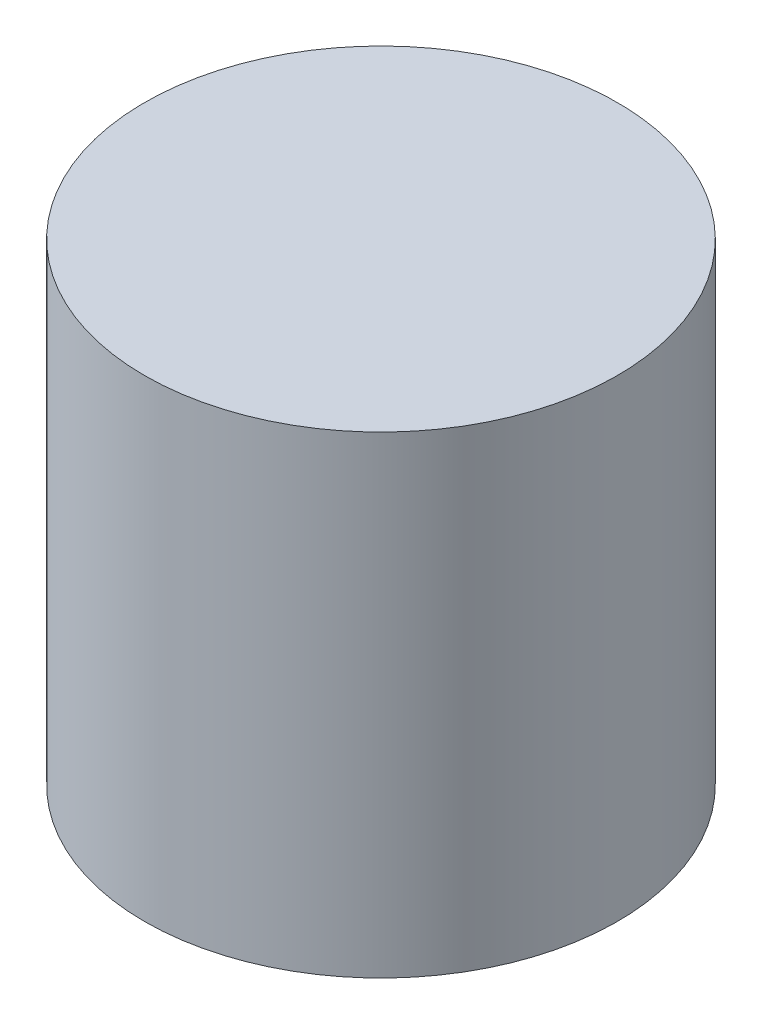
ISO-10303-21;
HEADER;
FILE_DESCRIPTION(('STEP AP214'),'2;1');
FILE_NAME('part.step','',(''),(''),'','','');
FILE_SCHEMA(('AUTOMOTIVE_DESIGN { 1 0 10303 214 1 1 1 1 }'));
ENDSEC;
DATA;
#1=APPLICATION_CONTEXT('core data for automotive mechanical design processes');
#2=APPLICATION_PROTOCOL_DEFINITION('international standard','automotive_design',2000,#1);
#3=PRODUCT_CONTEXT('',#1,'mechanical');
#4=PRODUCT('Part','Part','',(#3));
#5=PRODUCT_RELATED_PRODUCT_CATEGORY('part','',(#4));
#6=PRODUCT_DEFINITION_FORMATION('','',#4);
#7=PRODUCT_DEFINITION_CONTEXT('part definition',#1,'design');
#8=PRODUCT_DEFINITION('design','',#6,#7);
#9=PRODUCT_DEFINITION_SHAPE('','',#8);
#10=(LENGTH_UNIT() NAMED_UNIT(*) SI_UNIT(.MILLI.,.METRE.));
#11=(NAMED_UNIT(*) PLANE_ANGLE_UNIT() SI_UNIT($,.RADIAN.));
#12=(NAMED_UNIT(*) SI_UNIT($,.STERADIAN.) SOLID_ANGLE_UNIT());
#13=UNCERTAINTY_MEASURE_WITH_UNIT(LENGTH_MEASURE(1.E-05),#10,'distance_accuracy_value','');
#14=(GEOMETRIC_REPRESENTATION_CONTEXT(3) GLOBAL_UNCERTAINTY_ASSIGNED_CONTEXT((#13)) GLOBAL_UNIT_ASSIGNED_CONTEXT((#10,
#11,#12)) REPRESENTATION_CONTEXT('',''));
#15=CARTESIAN_POINT('',(0.,0.,0.));
#16=DIRECTION('',(0.,0.,1.));
#17=DIRECTION('',(1.,0.,0.));
#18=AXIS2_PLACEMENT_3D('',#15,#16,#17);
#19=CARTESIAN_POINT('',(0.,4.,0.));
#20=DIRECTION('',(0.,-1.,0.));
#21=DIRECTION('',(0.,0.,-1.));
#22=AXIS2_PLACEMENT_3D('',#19,#20,#21);
#23=CYLINDRICAL_SURFACE('',#22,2.);
#24=CARTESIAN_POINT('',(0.,4.,0.));
#25=DIRECTION('',(0.,1.,0.));
#26=DIRECTION('',(0.,0.,1.));
#27=AXIS2_PLACEMENT_3D('',#24,#25,#26);
#28=CIRCLE('',#27,2.);
#29=CARTESIAN_POINT('',(0.,4.,2.));
#30=VERTEX_POINT('',#29);
#31=EDGE_CURVE('E10',#30,#30,#28,.T.);
#32=ORIENTED_EDGE('',*,*,#31,.F.);
#33=EDGE_LOOP('',(#32));
#34=FACE_BOUND('',#33,.T.);
#35=CARTESIAN_POINT('',(0.,0.,0.));
#36=DIRECTION('',(0.,1.,0.));
#37=DIRECTION('',(0.,0.,1.));
#38=AXIS2_PLACEMENT_3D('',#35,#36,#37);
#39=CIRCLE('',#38,2.);
#40=CARTESIAN_POINT('',(0.,0.,2.));
#41=VERTEX_POINT('',#40);
#42=EDGE_CURVE('E42',#41,#41,#39,.T.);
#43=ORIENTED_EDGE('',*,*,#42,.T.);
#44=EDGE_LOOP('',(#43));
#45=FACE_BOUND('',#44,.T.);
#46=ADVANCED_FACE('F39',(#34,#45),#23,.T.);
#47=CARTESIAN_POINT('',(0.,4.,0.));
#48=DIRECTION('',(0.,1.,0.));
#49=DIRECTION('',(0.,0.,1.));
#50=AXIS2_PLACEMENT_3D('',#47,#48,#49);
#51=PLANE('',#50);
#52=ORIENTED_EDGE('',*,*,#31,.T.);
#53=EDGE_LOOP('',(#52));
#54=FACE_BOUND('',#53,.T.);
#55=ADVANCED_FACE('F54',(#54),#51,.T.);
#56=CARTESIAN_POINT('',(0.,0.,0.));
#57=DIRECTION('',(0.,1.,0.));
#58=DIRECTION('',(0.,0.,1.));
#59=AXIS2_PLACEMENT_3D('',#56,#57,#58);
#60=PLANE('',#59);
#61=ORIENTED_EDGE('',*,*,#42,.F.);
#62=EDGE_LOOP('',(#61));
#63=FACE_BOUND('',#62,.T.);
#64=ADVANCED_FACE('F52',(#63),#60,.F.);
#65=CLOSED_SHELL('',(#46,#55,#64));
#66=MANIFOLD_SOLID_BREP('B2',#65);
#67=ADVANCED_BREP_SHAPE_REPRESENTATION('',(#18,#66),#14);
#68=SHAPE_DEFINITION_REPRESENTATION(#9,#67);
ENDSEC;
END-ISO-10303-21;
